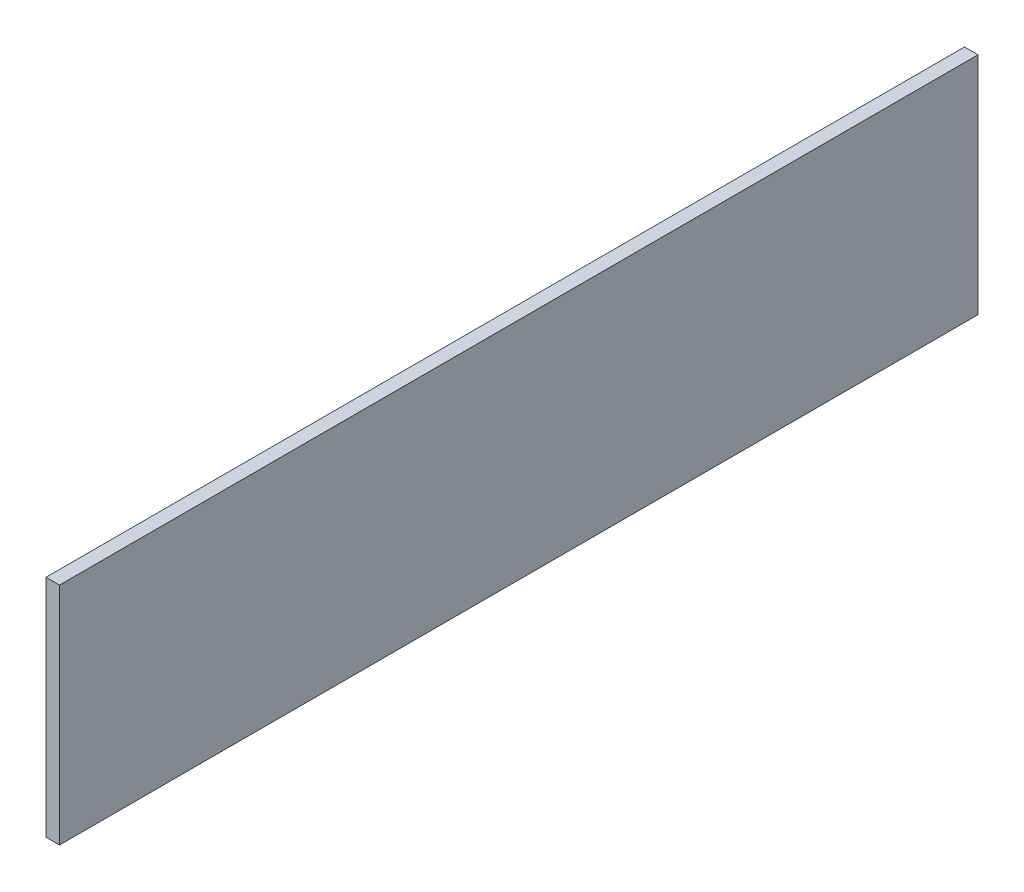
ISO-10303-21;
HEADER;
FILE_DESCRIPTION(('STEP AP214'),'2;1');
FILE_NAME('part.step','',(''),(''),'','','');
FILE_SCHEMA(('AUTOMOTIVE_DESIGN { 1 0 10303 214 1 1 1 1 }'));
ENDSEC;
DATA;
#1=APPLICATION_CONTEXT('core data for automotive mechanical design processes');
#2=APPLICATION_PROTOCOL_DEFINITION('international standard','automotive_design',2000,#1);
#3=PRODUCT_CONTEXT('',#1,'mechanical');
#4=PRODUCT('Part','Part','',(#3));
#5=PRODUCT_RELATED_PRODUCT_CATEGORY('part','',(#4));
#6=PRODUCT_DEFINITION_FORMATION('','',#4);
#7=PRODUCT_DEFINITION_CONTEXT('part definition',#1,'design');
#8=PRODUCT_DEFINITION('design','',#6,#7);
#9=PRODUCT_DEFINITION_SHAPE('','',#8);
#10=(LENGTH_UNIT() NAMED_UNIT(*) SI_UNIT(.MILLI.,.METRE.));
#11=(NAMED_UNIT(*) PLANE_ANGLE_UNIT() SI_UNIT($,.RADIAN.));
#12=(NAMED_UNIT(*) SI_UNIT($,.STERADIAN.) SOLID_ANGLE_UNIT());
#13=UNCERTAINTY_MEASURE_WITH_UNIT(LENGTH_MEASURE(1.E-05),#10,'distance_accuracy_value','');
#14=(GEOMETRIC_REPRESENTATION_CONTEXT(3) GLOBAL_UNCERTAINTY_ASSIGNED_CONTEXT((#13)) GLOBAL_UNIT_ASSIGNED_CONTEXT((#10,
#11,#12)) REPRESENTATION_CONTEXT('',''));
#15=CARTESIAN_POINT('',(0.,0.,0.));
#16=DIRECTION('',(0.,0.,1.));
#17=DIRECTION('',(1.,0.,0.));
#18=AXIS2_PLACEMENT_3D('',#15,#16,#17);
#19=CARTESIAN_POINT('',(3.,43.7667112299465,51.4933155080214));
#20=DIRECTION('',(0.,0.,-1.));
#21=DIRECTION('',(0.,1.,0.));
#22=AXIS2_PLACEMENT_3D('',#19,#20,#21);
#23=PLANE('',#22);
#24=DIRECTION('',(0.,-1.,0.));
#25=VECTOR('',#24,1.);
#26=CARTESIAN_POINT('',(0.,43.7667112299465,51.4933155080214));
#27=LINE('',#26,#25);
#28=CARTESIAN_POINT('',(0.,43.7667112299465,51.4933155080214));
#29=VERTEX_POINT('',#28);
#30=CARTESIAN_POINT('',(0.,-6.23328877005348,51.4933155080214));
#31=VERTEX_POINT('',#30);
#32=EDGE_CURVE('E107',#29,#31,#27,.T.);
#33=ORIENTED_EDGE('',*,*,#32,.T.);
#34=DIRECTION('',(-1.,0.,0.));
#35=VECTOR('',#34,1.);
#36=CARTESIAN_POINT('',(3.,-6.23328877005348,51.4933155080214));
#37=LINE('',#36,#35);
#38=CARTESIAN_POINT('',(3.,-6.23328877005348,51.4933155080214));
#39=VERTEX_POINT('',#38);
#40=EDGE_CURVE('E11',#39,#31,#37,.T.);
#41=ORIENTED_EDGE('',*,*,#40,.F.);
#42=DIRECTION('',(0.,-1.,0.));
#43=VECTOR('',#42,1.);
#44=CARTESIAN_POINT('',(3.,43.7667112299465,51.4933155080214));
#45=LINE('',#44,#43);
#46=CARTESIAN_POINT('',(3.,43.7667112299465,51.4933155080214));
#47=VERTEX_POINT('',#46);
#48=EDGE_CURVE('E91',#47,#39,#45,.T.);
#49=ORIENTED_EDGE('',*,*,#48,.F.);
#50=DIRECTION('',(-1.,0.,0.));
#51=VECTOR('',#50,1.);
#52=CARTESIAN_POINT('',(3.,43.7667112299465,51.4933155080214));
#53=LINE('',#52,#51);
#54=EDGE_CURVE('E103',#47,#29,#53,.T.);
#55=ORIENTED_EDGE('',*,*,#54,.T.);
#56=EDGE_LOOP('',(#33,#41,#49,#55));
#57=FACE_BOUND('',#56,.T.);
#58=ADVANCED_FACE('F39',(#57),#23,.F.);
#59=CARTESIAN_POINT('',(3.,-6.23328877005348,51.4933155080214));
#60=DIRECTION('',(0.,1.,0.));
#61=DIRECTION('',(0.,0.,1.));
#62=AXIS2_PLACEMENT_3D('',#59,#60,#61);
#63=PLANE('',#62);
#64=DIRECTION('',(0.,0.,-1.));
#65=VECTOR('',#64,1.);
#66=CARTESIAN_POINT('',(0.,-6.23328877005348,51.4933155080214));
#67=LINE('',#66,#65);
#68=CARTESIAN_POINT('',(0.,-6.23328877005348,-152.506684491979));
#69=VERTEX_POINT('',#68);
#70=EDGE_CURVE('E96',#31,#69,#67,.T.);
#71=ORIENTED_EDGE('',*,*,#70,.T.);
#72=DIRECTION('',(-1.,0.,0.));
#73=VECTOR('',#72,1.);
#74=CARTESIAN_POINT('',(3.,-6.23328877005348,-152.506684491979));
#75=LINE('',#74,#73);
#76=CARTESIAN_POINT('',(3.,-6.23328877005348,-152.506684491979));
#77=VERTEX_POINT('',#76);
#78=EDGE_CURVE('E48',#77,#69,#75,.T.);
#79=ORIENTED_EDGE('',*,*,#78,.F.);
#80=DIRECTION('',(0.,0.,-1.));
#81=VECTOR('',#80,1.);
#82=CARTESIAN_POINT('',(3.,-6.23328877005348,51.4933155080214));
#83=LINE('',#82,#81);
#84=EDGE_CURVE('E86',#39,#77,#83,.T.);
#85=ORIENTED_EDGE('',*,*,#84,.F.);
#86=ORIENTED_EDGE('',*,*,#40,.T.);
#87=EDGE_LOOP('',(#71,#79,#85,#86));
#88=FACE_BOUND('',#87,.T.);
#89=ADVANCED_FACE('F95',(#88),#63,.F.);
#90=CARTESIAN_POINT('',(3.,43.7667112299465,-152.506684491979));
#91=DIRECTION('',(0.,0.,1.));
#92=DIRECTION('',(1.,0.,0.));
#93=AXIS2_PLACEMENT_3D('',#90,#91,#92);
#94=PLANE('',#93);
#95=DIRECTION('',(0.,1.,0.));
#96=VECTOR('',#95,1.);
#97=CARTESIAN_POINT('',(0.,43.7667112299465,-152.506684491979));
#98=LINE('',#97,#96);
#99=CARTESIAN_POINT('',(0.,43.7667112299465,-152.506684491979));
#100=VERTEX_POINT('',#99);
#101=EDGE_CURVE('E73',#69,#100,#98,.T.);
#102=ORIENTED_EDGE('',*,*,#101,.T.);
#103=DIRECTION('',(-1.,0.,0.));
#104=VECTOR('',#103,1.);
#105=CARTESIAN_POINT('',(3.,43.7667112299465,-152.506684491979));
#106=LINE('',#105,#104);
#107=CARTESIAN_POINT('',(3.,43.7667112299465,-152.506684491979));
#108=VERTEX_POINT('',#107);
#109=EDGE_CURVE('E98',#108,#100,#106,.T.);
#110=ORIENTED_EDGE('',*,*,#109,.F.);
#111=DIRECTION('',(0.,1.,0.));
#112=VECTOR('',#111,1.);
#113=CARTESIAN_POINT('',(3.,43.7667112299465,-152.506684491979));
#114=LINE('',#113,#112);
#115=EDGE_CURVE('E89',#77,#108,#114,.T.);
#116=ORIENTED_EDGE('',*,*,#115,.F.);
#117=ORIENTED_EDGE('',*,*,#78,.T.);
#118=EDGE_LOOP('',(#102,#110,#116,#117));
#119=FACE_BOUND('',#118,.T.);
#120=ADVANCED_FACE('F99',(#119),#94,.F.);
#121=CARTESIAN_POINT('',(3.,43.7667112299465,51.4933155080214));
#122=DIRECTION('',(0.,-1.,0.));
#123=DIRECTION('',(0.,0.,-1.));
#124=AXIS2_PLACEMENT_3D('',#121,#122,#123);
#125=PLANE('',#124);
#126=DIRECTION('',(0.,0.,1.));
#127=VECTOR('',#126,1.);
#128=CARTESIAN_POINT('',(0.,43.7667112299465,51.4933155080214));
#129=LINE('',#128,#127);
#130=EDGE_CURVE('E79',#100,#29,#129,.T.);
#131=ORIENTED_EDGE('',*,*,#130,.T.);
#132=ORIENTED_EDGE('',*,*,#54,.F.);
#133=DIRECTION('',(0.,0.,1.));
#134=VECTOR('',#133,1.);
#135=CARTESIAN_POINT('',(3.,43.7667112299465,51.4933155080214));
#136=LINE('',#135,#134);
#137=EDGE_CURVE('E56',#108,#47,#136,.T.);
#138=ORIENTED_EDGE('',*,*,#137,.F.);
#139=ORIENTED_EDGE('',*,*,#109,.T.);
#140=EDGE_LOOP('',(#131,#132,#138,#139));
#141=FACE_BOUND('',#140,.T.);
#142=ADVANCED_FACE('F120',(#141),#125,.F.);
#143=CARTESIAN_POINT('',(3.,0.,0.));
#144=DIRECTION('',(1.,0.,0.));
#145=DIRECTION('',(0.,0.,-1.));
#146=AXIS2_PLACEMENT_3D('',#143,#144,#145);
#147=PLANE('',#146);
#148=ORIENTED_EDGE('',*,*,#48,.T.);
#149=ORIENTED_EDGE('',*,*,#84,.T.);
#150=ORIENTED_EDGE('',*,*,#115,.T.);
#151=ORIENTED_EDGE('',*,*,#137,.T.);
#152=EDGE_LOOP('',(#148,#149,#150,#151));
#153=FACE_BOUND('',#152,.T.);
#154=ADVANCED_FACE('F87',(#153),#147,.T.);
#155=CARTESIAN_POINT('',(0.,0.,0.));
#156=DIRECTION('',(1.,0.,0.));
#157=DIRECTION('',(0.,0.,-1.));
#158=AXIS2_PLACEMENT_3D('',#155,#156,#157);
#159=PLANE('',#158);
#160=ORIENTED_EDGE('',*,*,#32,.F.);
#161=ORIENTED_EDGE('',*,*,#130,.F.);
#162=ORIENTED_EDGE('',*,*,#101,.F.);
#163=ORIENTED_EDGE('',*,*,#70,.F.);
#164=EDGE_LOOP('',(#160,#161,#162,#163));
#165=FACE_BOUND('',#164,.T.);
#166=ADVANCED_FACE('F123',(#165),#159,.F.);
#167=CLOSED_SHELL('',(#58,#89,#120,#142,#154,#166));
#168=MANIFOLD_SOLID_BREP('B2',#167);
#169=ADVANCED_BREP_SHAPE_REPRESENTATION('',(#18,#168),#14);
#170=SHAPE_DEFINITION_REPRESENTATION(#9,#169);
ENDSEC;
END-ISO-10303-21;
